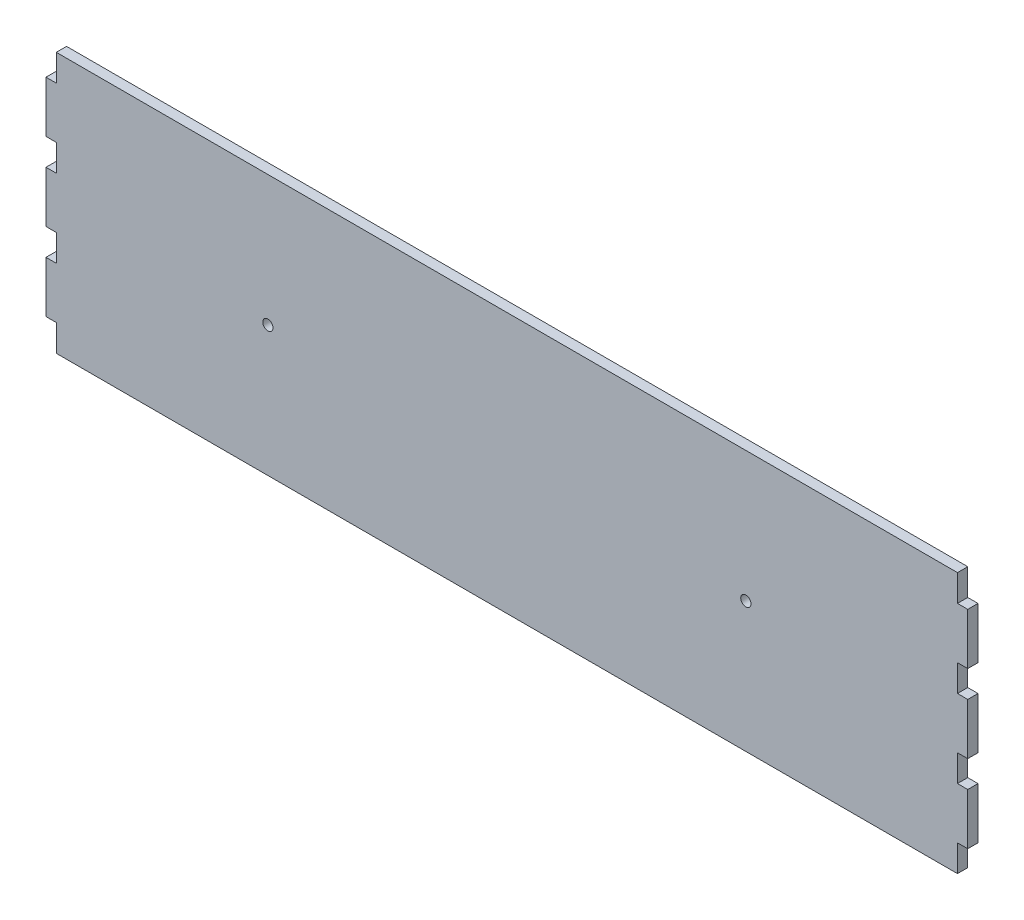
ISO-10303-21;
HEADER;
FILE_DESCRIPTION(('STEP AP214'),'2;1');
FILE_NAME('part.step','',(''),(''),'','','');
FILE_SCHEMA(('AUTOMOTIVE_DESIGN { 1 0 10303 214 1 1 1 1 }'));
ENDSEC;
DATA;
#1=APPLICATION_CONTEXT('core data for automotive mechanical design processes');
#2=APPLICATION_PROTOCOL_DEFINITION('international standard','automotive_design',2000,#1);
#3=PRODUCT_CONTEXT('',#1,'mechanical');
#4=PRODUCT('Part','Part','',(#3));
#5=PRODUCT_RELATED_PRODUCT_CATEGORY('part','',(#4));
#6=PRODUCT_DEFINITION_FORMATION('','',#4);
#7=PRODUCT_DEFINITION_CONTEXT('part definition',#1,'design');
#8=PRODUCT_DEFINITION('design','',#6,#7);
#9=PRODUCT_DEFINITION_SHAPE('','',#8);
#10=(LENGTH_UNIT() NAMED_UNIT(*) SI_UNIT(.MILLI.,.METRE.));
#11=(NAMED_UNIT(*) PLANE_ANGLE_UNIT() SI_UNIT($,.RADIAN.));
#12=(NAMED_UNIT(*) SI_UNIT($,.STERADIAN.) SOLID_ANGLE_UNIT());
#13=UNCERTAINTY_MEASURE_WITH_UNIT(LENGTH_MEASURE(1.E-05),#10,'distance_accuracy_value','');
#14=(GEOMETRIC_REPRESENTATION_CONTEXT(3) GLOBAL_UNCERTAINTY_ASSIGNED_CONTEXT((#13)) GLOBAL_UNIT_ASSIGNED_CONTEXT((#10,
#11,#12)) REPRESENTATION_CONTEXT('',''));
#15=CARTESIAN_POINT('',(0.,0.,0.));
#16=DIRECTION('',(0.,0.,1.));
#17=DIRECTION('',(1.,0.,0.));
#18=AXIS2_PLACEMENT_3D('',#15,#16,#17);
#19=CARTESIAN_POINT('',(134.7,38.1,3.));
#20=DIRECTION('',(-1.,0.,0.));
#21=DIRECTION('',(0.,0.,1.));
#22=AXIS2_PLACEMENT_3D('',#19,#20,#21);
#23=PLANE('',#22);
#24=DIRECTION('',(0.,0.,1.));
#25=VECTOR('',#24,1.);
#26=CARTESIAN_POINT('',(134.7,30.3,0.));
#27=LINE('',#26,#25);
#28=CARTESIAN_POINT('',(134.7,30.3,0.));
#29=VERTEX_POINT('',#28);
#30=CARTESIAN_POINT('',(134.7,30.3,3.));
#31=VERTEX_POINT('',#30);
#32=EDGE_CURVE('E314',#29,#31,#27,.T.);
#33=ORIENTED_EDGE('',*,*,#32,.T.);
#34=DIRECTION('',(0.,1.,0.));
#35=VECTOR('',#34,1.);
#36=CARTESIAN_POINT('',(134.7,38.1,3.));
#37=LINE('',#36,#35);
#38=CARTESIAN_POINT('',(134.7,15.3,3.));
#39=VERTEX_POINT('',#38);
#40=EDGE_CURVE('E260',#39,#31,#37,.T.);
#41=ORIENTED_EDGE('',*,*,#40,.F.);
#42=DIRECTION('',(0.,0.,1.));
#43=VECTOR('',#42,1.);
#44=CARTESIAN_POINT('',(134.7,15.3,0.));
#45=LINE('',#44,#43);
#46=CARTESIAN_POINT('',(134.7,15.3,0.));
#47=VERTEX_POINT('',#46);
#48=EDGE_CURVE('E496',#47,#39,#45,.T.);
#49=ORIENTED_EDGE('',*,*,#48,.F.);
#50=DIRECTION('',(0.,1.,0.));
#51=VECTOR('',#50,1.);
#52=CARTESIAN_POINT('',(134.7,38.1,0.));
#53=LINE('',#52,#51);
#54=EDGE_CURVE('E253',#47,#29,#53,.T.);
#55=ORIENTED_EDGE('',*,*,#54,.T.);
#56=EDGE_LOOP('',(#33,#41,#49,#55));
#57=FACE_BOUND('',#56,.T.);
#58=ADVANCED_FACE('F37',(#57),#23,.F.);
#59=DIRECTION('',(0.,0.,1.));
#60=VECTOR('',#59,1.);
#61=CARTESIAN_POINT('',(134.7,7.5,0.));
#62=LINE('',#61,#60);
#63=CARTESIAN_POINT('',(134.7,7.5,0.));
#64=VERTEX_POINT('',#63);
#65=CARTESIAN_POINT('',(134.7,7.5,3.));
#66=VERTEX_POINT('',#65);
#67=EDGE_CURVE('E484',#64,#66,#62,.T.);
#68=ORIENTED_EDGE('',*,*,#67,.T.);
#69=CARTESIAN_POINT('',(134.7,-7.5,3.));
#70=VERTEX_POINT('',#69);
#71=EDGE_CURVE('E339',#70,#66,#37,.T.);
#72=ORIENTED_EDGE('',*,*,#71,.F.);
#73=DIRECTION('',(0.,0.,1.));
#74=VECTOR('',#73,1.);
#75=CARTESIAN_POINT('',(134.7,-7.5,0.));
#76=LINE('',#75,#74);
#77=CARTESIAN_POINT('',(134.7,-7.5,0.));
#78=VERTEX_POINT('',#77);
#79=EDGE_CURVE('E482',#78,#70,#76,.T.);
#80=ORIENTED_EDGE('',*,*,#79,.F.);
#81=EDGE_CURVE('E251',#78,#64,#53,.T.);
#82=ORIENTED_EDGE('',*,*,#81,.T.);
#83=EDGE_LOOP('',(#68,#72,#80,#82));
#84=FACE_BOUND('',#83,.T.);
#85=ADVANCED_FACE('F447',(#84),#23,.F.);
#86=DIRECTION('',(0.,0.,1.));
#87=VECTOR('',#86,1.);
#88=CARTESIAN_POINT('',(134.7,-15.3,0.));
#89=LINE('',#88,#87);
#90=CARTESIAN_POINT('',(134.7,-15.3,0.));
#91=VERTEX_POINT('',#90);
#92=CARTESIAN_POINT('',(134.7,-15.3,3.));
#93=VERTEX_POINT('',#92);
#94=EDGE_CURVE('E461',#91,#93,#89,.T.);
#95=ORIENTED_EDGE('',*,*,#94,.T.);
#96=CARTESIAN_POINT('',(134.7,-30.3,3.));
#97=VERTEX_POINT('',#96);
#98=EDGE_CURVE('E340',#97,#93,#37,.T.);
#99=ORIENTED_EDGE('',*,*,#98,.F.);
#100=DIRECTION('',(0.,0.,1.));
#101=VECTOR('',#100,1.);
#102=CARTESIAN_POINT('',(134.7,-30.3,0.));
#103=LINE('',#102,#101);
#104=CARTESIAN_POINT('',(134.7,-30.3,0.));
#105=VERTEX_POINT('',#104);
#106=EDGE_CURVE('E393',#105,#97,#103,.T.);
#107=ORIENTED_EDGE('',*,*,#106,.F.);
#108=EDGE_CURVE('E245',#105,#91,#53,.T.);
#109=ORIENTED_EDGE('',*,*,#108,.T.);
#110=EDGE_LOOP('',(#95,#99,#107,#109));
#111=FACE_BOUND('',#110,.T.);
#112=ADVANCED_FACE('F449',(#111),#23,.F.);
#113=CARTESIAN_POINT('',(-134.7,38.1,3.));
#114=DIRECTION('',(0.,-1.,0.));
#115=DIRECTION('',(0.,0.,-1.));
#116=AXIS2_PLACEMENT_3D('',#113,#114,#115);
#117=PLANE('',#116);
#118=DIRECTION('',(0.,0.,1.));
#119=VECTOR('',#118,1.);
#120=CARTESIAN_POINT('',(131.7,38.1,0.));
#121=LINE('',#120,#119);
#122=CARTESIAN_POINT('',(131.7,38.1,0.));
#123=VERTEX_POINT('',#122);
#124=CARTESIAN_POINT('',(131.7,38.1,3.));
#125=VERTEX_POINT('',#124);
#126=EDGE_CURVE('E224',#123,#125,#121,.T.);
#127=ORIENTED_EDGE('',*,*,#126,.F.);
#128=DIRECTION('',(-1.,0.,0.));
#129=VECTOR('',#128,1.);
#130=CARTESIAN_POINT('',(-134.7,38.1,0.));
#131=LINE('',#130,#129);
#132=CARTESIAN_POINT('',(-131.7,38.1,0.));
#133=VERTEX_POINT('',#132);
#134=EDGE_CURVE('E236',#123,#133,#131,.T.);
#135=ORIENTED_EDGE('',*,*,#134,.T.);
#136=DIRECTION('',(0.,0.,1.));
#137=VECTOR('',#136,1.);
#138=CARTESIAN_POINT('',(-131.7,38.1,0.));
#139=LINE('',#138,#137);
#140=CARTESIAN_POINT('',(-131.7,38.1,3.));
#141=VERTEX_POINT('',#140);
#142=EDGE_CURVE('E332',#133,#141,#139,.T.);
#143=ORIENTED_EDGE('',*,*,#142,.T.);
#144=DIRECTION('',(-1.,0.,0.));
#145=VECTOR('',#144,1.);
#146=CARTESIAN_POINT('',(-134.7,38.1,3.));
#147=LINE('',#146,#145);
#148=EDGE_CURVE('E238',#125,#141,#147,.T.);
#149=ORIENTED_EDGE('',*,*,#148,.F.);
#150=EDGE_LOOP('',(#127,#135,#143,#149));
#151=FACE_BOUND('',#150,.T.);
#152=ADVANCED_FACE('F234',(#151),#117,.F.);
#153=CARTESIAN_POINT('',(-134.7,-38.1,3.));
#154=DIRECTION('',(0.,1.,0.));
#155=DIRECTION('',(0.,0.,1.));
#156=AXIS2_PLACEMENT_3D('',#153,#154,#155);
#157=PLANE('',#156);
#158=DIRECTION('',(0.,0.,1.));
#159=VECTOR('',#158,1.);
#160=CARTESIAN_POINT('',(131.7,-38.1,0.));
#161=LINE('',#160,#159);
#162=CARTESIAN_POINT('',(131.7,-38.1,0.));
#163=VERTEX_POINT('',#162);
#164=CARTESIAN_POINT('',(131.7,-38.1,3.));
#165=VERTEX_POINT('',#164);
#166=EDGE_CURVE('E372',#163,#165,#161,.T.);
#167=ORIENTED_EDGE('',*,*,#166,.T.);
#168=DIRECTION('',(1.,0.,0.));
#169=VECTOR('',#168,1.);
#170=CARTESIAN_POINT('',(-134.7,-38.1,3.));
#171=LINE('',#170,#169);
#172=CARTESIAN_POINT('',(-131.7,-38.1,3.));
#173=VERTEX_POINT('',#172);
#174=EDGE_CURVE('E11',#173,#165,#171,.T.);
#175=ORIENTED_EDGE('',*,*,#174,.F.);
#176=DIRECTION('',(0.,0.,1.));
#177=VECTOR('',#176,1.);
#178=CARTESIAN_POINT('',(-131.7,-38.1,0.));
#179=LINE('',#178,#177);
#180=CARTESIAN_POINT('',(-131.7,-38.1,0.));
#181=VERTEX_POINT('',#180);
#182=EDGE_CURVE('E310',#181,#173,#179,.T.);
#183=ORIENTED_EDGE('',*,*,#182,.F.);
#184=DIRECTION('',(1.,0.,0.));
#185=VECTOR('',#184,1.);
#186=CARTESIAN_POINT('',(-134.7,-38.1,0.));
#187=LINE('',#186,#185);
#188=EDGE_CURVE('E40',#181,#163,#187,.T.);
#189=ORIENTED_EDGE('',*,*,#188,.T.);
#190=EDGE_LOOP('',(#167,#175,#183,#189));
#191=FACE_BOUND('',#190,.T.);
#192=ADVANCED_FACE('F371',(#191),#157,.F.);
#193=CARTESIAN_POINT('',(0.,0.,3.));
#194=DIRECTION('',(0.,0.,1.));
#195=DIRECTION('',(1.,0.,0.));
#196=AXIS2_PLACEMENT_3D('',#193,#194,#195);
#197=PLANE('',#196);
#198=CARTESIAN_POINT('',(-69.8499999999999,0.,3.));
#199=DIRECTION('',(0.,0.,1.));
#200=DIRECTION('',(1.,0.,0.));
#201=AXIS2_PLACEMENT_3D('',#198,#199,#200);
#202=CIRCLE('',#201,1.49999999999999);
#203=CARTESIAN_POINT('',(-68.35,0.,3.));
#204=VERTEX_POINT('',#203);
#205=EDGE_CURVE('E705',#204,#204,#202,.T.);
#206=ORIENTED_EDGE('',*,*,#205,.F.);
#207=EDGE_LOOP('',(#206));
#208=FACE_BOUND('',#207,.T.);
#209=CARTESIAN_POINT('',(69.8499999999999,0.,3.));
#210=DIRECTION('',(0.,0.,1.));
#211=DIRECTION('',(1.,0.,0.));
#212=AXIS2_PLACEMENT_3D('',#209,#210,#211);
#213=CIRCLE('',#212,1.49999999999999);
#214=CARTESIAN_POINT('',(71.3499999999999,0.,3.));
#215=VERTEX_POINT('',#214);
#216=EDGE_CURVE('E707',#215,#215,#213,.T.);
#217=ORIENTED_EDGE('',*,*,#216,.F.);
#218=EDGE_LOOP('',(#217));
#219=FACE_BOUND('',#218,.T.);
#220=ORIENTED_EDGE('',*,*,#40,.T.);
#221=DIRECTION('',(-1.,0.,0.));
#222=VECTOR('',#221,1.);
#223=CARTESIAN_POINT('',(134.7,30.3,3.));
#224=LINE('',#223,#222);
#225=CARTESIAN_POINT('',(131.7,30.3,3.));
#226=VERTEX_POINT('',#225);
#227=EDGE_CURVE('E230',#31,#226,#224,.T.);
#228=ORIENTED_EDGE('',*,*,#227,.T.);
#229=DIRECTION('',(0.,1.,0.));
#230=VECTOR('',#229,1.);
#231=CARTESIAN_POINT('',(131.7,38.1,3.));
#232=LINE('',#231,#230);
#233=EDGE_CURVE('E487',#226,#125,#232,.T.);
#234=ORIENTED_EDGE('',*,*,#233,.T.);
#235=ORIENTED_EDGE('',*,*,#148,.T.);
#236=DIRECTION('',(0.,1.,0.));
#237=VECTOR('',#236,1.);
#238=CARTESIAN_POINT('',(-131.7,38.1,3.));
#239=LINE('',#238,#237);
#240=CARTESIAN_POINT('',(-131.7,30.3,3.));
#241=VERTEX_POINT('',#240);
#242=EDGE_CURVE('E323',#241,#141,#239,.T.);
#243=ORIENTED_EDGE('',*,*,#242,.F.);
#244=DIRECTION('',(1.,0.,0.));
#245=VECTOR('',#244,1.);
#246=CARTESIAN_POINT('',(-134.7,30.3,3.));
#247=LINE('',#246,#245);
#248=CARTESIAN_POINT('',(-134.7,30.3,3.));
#249=VERTEX_POINT('',#248);
#250=EDGE_CURVE('E326',#249,#241,#247,.T.);
#251=ORIENTED_EDGE('',*,*,#250,.F.);
#252=DIRECTION('',(0.,-1.,0.));
#253=VECTOR('',#252,1.);
#254=CARTESIAN_POINT('',(-134.7,38.1,3.));
#255=LINE('',#254,#253);
#256=CARTESIAN_POINT('',(-134.7,15.3,3.));
#257=VERTEX_POINT('',#256);
#258=EDGE_CURVE('E45',#249,#257,#255,.T.);
#259=ORIENTED_EDGE('',*,*,#258,.T.);
#260=DIRECTION('',(-1.,0.,0.));
#261=VECTOR('',#260,1.);
#262=CARTESIAN_POINT('',(-134.7,15.3,3.));
#263=LINE('',#262,#261);
#264=CARTESIAN_POINT('',(-131.7,15.3,3.));
#265=VERTEX_POINT('',#264);
#266=EDGE_CURVE('E397',#265,#257,#263,.T.);
#267=ORIENTED_EDGE('',*,*,#266,.F.);
#268=DIRECTION('',(0.,1.,0.));
#269=VECTOR('',#268,1.);
#270=CARTESIAN_POINT('',(-131.7,15.3,3.));
#271=LINE('',#270,#269);
#272=CARTESIAN_POINT('',(-131.7,7.5,3.));
#273=VERTEX_POINT('',#272);
#274=EDGE_CURVE('E404',#273,#265,#271,.T.);
#275=ORIENTED_EDGE('',*,*,#274,.F.);
#276=DIRECTION('',(1.,0.,0.));
#277=VECTOR('',#276,1.);
#278=CARTESIAN_POINT('',(-134.7,7.5,3.));
#279=LINE('',#278,#277);
#280=CARTESIAN_POINT('',(-134.7,7.5,3.));
#281=VERTEX_POINT('',#280);
#282=EDGE_CURVE('E299',#281,#273,#279,.T.);
#283=ORIENTED_EDGE('',*,*,#282,.F.);
#284=CARTESIAN_POINT('',(-134.7,-7.5,3.));
#285=VERTEX_POINT('',#284);
#286=EDGE_CURVE('E344',#281,#285,#255,.T.);
#287=ORIENTED_EDGE('',*,*,#286,.T.);
#288=DIRECTION('',(-1.,0.,0.));
#289=VECTOR('',#288,1.);
#290=CARTESIAN_POINT('',(-134.7,-7.5,3.));
#291=LINE('',#290,#289);
#292=CARTESIAN_POINT('',(-131.7,-7.5,3.));
#293=VERTEX_POINT('',#292);
#294=EDGE_CURVE('E296',#293,#285,#291,.T.);
#295=ORIENTED_EDGE('',*,*,#294,.F.);
#296=DIRECTION('',(0.,1.,0.));
#297=VECTOR('',#296,1.);
#298=CARTESIAN_POINT('',(-131.7,-7.5,3.));
#299=LINE('',#298,#297);
#300=CARTESIAN_POINT('',(-131.7,-15.3,3.));
#301=VERTEX_POINT('',#300);
#302=EDGE_CURVE('E292',#301,#293,#299,.T.);
#303=ORIENTED_EDGE('',*,*,#302,.F.);
#304=DIRECTION('',(1.,0.,0.));
#305=VECTOR('',#304,1.);
#306=CARTESIAN_POINT('',(-134.7,-15.3,3.));
#307=LINE('',#306,#305);
#308=CARTESIAN_POINT('',(-134.7,-15.3,3.));
#309=VERTEX_POINT('',#308);
#310=EDGE_CURVE('E289',#309,#301,#307,.T.);
#311=ORIENTED_EDGE('',*,*,#310,.F.);
#312=CARTESIAN_POINT('',(-134.7,-30.3,3.));
#313=VERTEX_POINT('',#312);
#314=EDGE_CURVE('E342',#309,#313,#255,.T.);
#315=ORIENTED_EDGE('',*,*,#314,.T.);
#316=DIRECTION('',(-1.,0.,0.));
#317=VECTOR('',#316,1.);
#318=CARTESIAN_POINT('',(-134.7,-30.3,3.));
#319=LINE('',#318,#317);
#320=CARTESIAN_POINT('',(-131.7,-30.3,3.));
#321=VERTEX_POINT('',#320);
#322=EDGE_CURVE('E307',#321,#313,#319,.T.);
#323=ORIENTED_EDGE('',*,*,#322,.F.);
#324=DIRECTION('',(0.,1.,0.));
#325=VECTOR('',#324,1.);
#326=CARTESIAN_POINT('',(-131.7,-30.3,3.));
#327=LINE('',#326,#325);
#328=EDGE_CURVE('E311',#173,#321,#327,.T.);
#329=ORIENTED_EDGE('',*,*,#328,.F.);
#330=ORIENTED_EDGE('',*,*,#174,.T.);
#331=DIRECTION('',(0.,1.,0.));
#332=VECTOR('',#331,1.);
#333=CARTESIAN_POINT('',(131.7,-30.3,3.));
#334=LINE('',#333,#332);
#335=CARTESIAN_POINT('',(131.7,-30.3,3.));
#336=VERTEX_POINT('',#335);
#337=EDGE_CURVE('E375',#165,#336,#334,.T.);
#338=ORIENTED_EDGE('',*,*,#337,.T.);
#339=DIRECTION('',(1.,0.,0.));
#340=VECTOR('',#339,1.);
#341=CARTESIAN_POINT('',(134.7,-30.3,3.));
#342=LINE('',#341,#340);
#343=EDGE_CURVE('E378',#336,#97,#342,.T.);
#344=ORIENTED_EDGE('',*,*,#343,.T.);
#345=ORIENTED_EDGE('',*,*,#98,.T.);
#346=DIRECTION('',(-1.,0.,0.));
#347=VECTOR('',#346,1.);
#348=CARTESIAN_POINT('',(134.7,-15.3,3.));
#349=LINE('',#348,#347);
#350=CARTESIAN_POINT('',(131.7,-15.3,3.));
#351=VERTEX_POINT('',#350);
#352=EDGE_CURVE('E471',#93,#351,#349,.T.);
#353=ORIENTED_EDGE('',*,*,#352,.T.);
#354=DIRECTION('',(0.,1.,0.));
#355=VECTOR('',#354,1.);
#356=CARTESIAN_POINT('',(131.7,-7.5,3.));
#357=LINE('',#356,#355);
#358=CARTESIAN_POINT('',(131.7,-7.5,3.));
#359=VERTEX_POINT('',#358);
#360=EDGE_CURVE('E507',#351,#359,#357,.T.);
#361=ORIENTED_EDGE('',*,*,#360,.T.);
#362=DIRECTION('',(1.,0.,0.));
#363=VECTOR('',#362,1.);
#364=CARTESIAN_POINT('',(134.7,-7.5,3.));
#365=LINE('',#364,#363);
#366=EDGE_CURVE('E390',#359,#70,#365,.T.);
#367=ORIENTED_EDGE('',*,*,#366,.T.);
#368=ORIENTED_EDGE('',*,*,#71,.T.);
#369=DIRECTION('',(-1.,0.,0.));
#370=VECTOR('',#369,1.);
#371=CARTESIAN_POINT('',(134.7,7.5,3.));
#372=LINE('',#371,#370);
#373=CARTESIAN_POINT('',(131.7,7.5,3.));
#374=VERTEX_POINT('',#373);
#375=EDGE_CURVE('E477',#66,#374,#372,.T.);
#376=ORIENTED_EDGE('',*,*,#375,.T.);
#377=DIRECTION('',(0.,1.,0.));
#378=VECTOR('',#377,1.);
#379=CARTESIAN_POINT('',(131.7,15.3,3.));
#380=LINE('',#379,#378);
#381=CARTESIAN_POINT('',(131.7,15.3,3.));
#382=VERTEX_POINT('',#381);
#383=EDGE_CURVE('E725',#374,#382,#380,.T.);
#384=ORIENTED_EDGE('',*,*,#383,.T.);
#385=DIRECTION('',(1.,0.,0.));
#386=VECTOR('',#385,1.);
#387=CARTESIAN_POINT('',(134.7,15.3,3.));
#388=LINE('',#387,#386);
#389=EDGE_CURVE('E466',#382,#39,#388,.T.);
#390=ORIENTED_EDGE('',*,*,#389,.T.);
#391=EDGE_LOOP('',(#220,#228,#234,#235,#243,#251,#259,#267,#275,#283,#287,#295,#303,#311,#315,
#323,#329,#330,#338,#344,#345,#353,#361,#367,#368,#376,#384,#390));
#392=FACE_BOUND('',#391,.T.);
#393=ADVANCED_FACE('F353',(#208,#219,#392),#197,.T.);
#394=CARTESIAN_POINT('',(0.,0.,0.));
#395=DIRECTION('',(0.,0.,1.));
#396=DIRECTION('',(1.,0.,0.));
#397=AXIS2_PLACEMENT_3D('',#394,#395,#396);
#398=PLANE('',#397);
#399=CARTESIAN_POINT('',(-69.8499999999999,0.,0.));
#400=DIRECTION('',(0.,0.,1.));
#401=DIRECTION('',(1.,0.,0.));
#402=AXIS2_PLACEMENT_3D('',#399,#400,#401);
#403=CIRCLE('',#402,1.5);
#404=CARTESIAN_POINT('',(-68.3499999999999,0.,0.));
#405=VERTEX_POINT('',#404);
#406=EDGE_CURVE('E702',#405,#405,#403,.T.);
#407=ORIENTED_EDGE('',*,*,#406,.T.);
#408=EDGE_LOOP('',(#407));
#409=FACE_BOUND('',#408,.T.);
#410=CARTESIAN_POINT('',(69.8499999999999,0.,0.));
#411=DIRECTION('',(0.,0.,1.));
#412=DIRECTION('',(1.,0.,0.));
#413=AXIS2_PLACEMENT_3D('',#410,#411,#412);
#414=CIRCLE('',#413,1.5);
#415=CARTESIAN_POINT('',(71.3499999999999,0.,0.));
#416=VERTEX_POINT('',#415);
#417=EDGE_CURVE('E385',#416,#416,#414,.T.);
#418=ORIENTED_EDGE('',*,*,#417,.T.);
#419=EDGE_LOOP('',(#418));
#420=FACE_BOUND('',#419,.T.);
#421=DIRECTION('',(-1.,0.,0.));
#422=VECTOR('',#421,1.);
#423=CARTESIAN_POINT('',(134.7,30.3,0.));
#424=LINE('',#423,#422);
#425=CARTESIAN_POINT('',(131.7,30.3,0.));
#426=VERTEX_POINT('',#425);
#427=EDGE_CURVE('E229',#29,#426,#424,.T.);
#428=ORIENTED_EDGE('',*,*,#427,.F.);
#429=ORIENTED_EDGE('',*,*,#54,.F.);
#430=DIRECTION('',(1.,0.,0.));
#431=VECTOR('',#430,1.);
#432=CARTESIAN_POINT('',(134.7,15.3,0.));
#433=LINE('',#432,#431);
#434=CARTESIAN_POINT('',(131.7,15.3,0.));
#435=VERTEX_POINT('',#434);
#436=EDGE_CURVE('E719',#435,#47,#433,.T.);
#437=ORIENTED_EDGE('',*,*,#436,.F.);
#438=DIRECTION('',(0.,1.,0.));
#439=VECTOR('',#438,1.);
#440=CARTESIAN_POINT('',(131.7,15.3,0.));
#441=LINE('',#440,#439);
#442=CARTESIAN_POINT('',(131.7,7.5,0.));
#443=VERTEX_POINT('',#442);
#444=EDGE_CURVE('E721',#443,#435,#441,.T.);
#445=ORIENTED_EDGE('',*,*,#444,.F.);
#446=DIRECTION('',(-1.,0.,0.));
#447=VECTOR('',#446,1.);
#448=CARTESIAN_POINT('',(134.7,7.5,0.));
#449=LINE('',#448,#447);
#450=EDGE_CURVE('E498',#64,#443,#449,.T.);
#451=ORIENTED_EDGE('',*,*,#450,.F.);
#452=ORIENTED_EDGE('',*,*,#81,.F.);
#453=DIRECTION('',(1.,0.,0.));
#454=VECTOR('',#453,1.);
#455=CARTESIAN_POINT('',(134.7,-7.5,0.));
#456=LINE('',#455,#454);
#457=CARTESIAN_POINT('',(131.7,-7.5,0.));
#458=VERTEX_POINT('',#457);
#459=EDGE_CURVE('E499',#458,#78,#456,.T.);
#460=ORIENTED_EDGE('',*,*,#459,.F.);
#461=DIRECTION('',(0.,1.,0.));
#462=VECTOR('',#461,1.);
#463=CARTESIAN_POINT('',(131.7,-7.5,0.));
#464=LINE('',#463,#462);
#465=CARTESIAN_POINT('',(131.7,-15.3,0.));
#466=VERTEX_POINT('',#465);
#467=EDGE_CURVE('E501',#466,#458,#464,.T.);
#468=ORIENTED_EDGE('',*,*,#467,.F.);
#469=DIRECTION('',(-1.,0.,0.));
#470=VECTOR('',#469,1.);
#471=CARTESIAN_POINT('',(134.7,-15.3,0.));
#472=LINE('',#471,#470);
#473=EDGE_CURVE('E504',#91,#466,#472,.T.);
#474=ORIENTED_EDGE('',*,*,#473,.F.);
#475=ORIENTED_EDGE('',*,*,#108,.F.);
#476=DIRECTION('',(1.,0.,0.));
#477=VECTOR('',#476,1.);
#478=CARTESIAN_POINT('',(134.7,-30.3,0.));
#479=LINE('',#478,#477);
#480=CARTESIAN_POINT('',(131.7,-30.3,0.));
#481=VERTEX_POINT('',#480);
#482=EDGE_CURVE('E381',#481,#105,#479,.T.);
#483=ORIENTED_EDGE('',*,*,#482,.F.);
#484=DIRECTION('',(0.,1.,0.));
#485=VECTOR('',#484,1.);
#486=CARTESIAN_POINT('',(131.7,-30.3,0.));
#487=LINE('',#486,#485);
#488=EDGE_CURVE('E383',#163,#481,#487,.T.);
#489=ORIENTED_EDGE('',*,*,#488,.F.);
#490=ORIENTED_EDGE('',*,*,#188,.F.);
#491=DIRECTION('',(0.,1.,0.));
#492=VECTOR('',#491,1.);
#493=CARTESIAN_POINT('',(-131.7,-30.3,0.));
#494=LINE('',#493,#492);
#495=CARTESIAN_POINT('',(-131.7,-30.3,0.));
#496=VERTEX_POINT('',#495);
#497=EDGE_CURVE('E303',#181,#496,#494,.T.);
#498=ORIENTED_EDGE('',*,*,#497,.T.);
#499=DIRECTION('',(-1.,0.,0.));
#500=VECTOR('',#499,1.);
#501=CARTESIAN_POINT('',(-134.7,-30.3,0.));
#502=LINE('',#501,#500);
#503=CARTESIAN_POINT('',(-134.7,-30.3,0.));
#504=VERTEX_POINT('',#503);
#505=EDGE_CURVE('E306',#496,#504,#502,.T.);
#506=ORIENTED_EDGE('',*,*,#505,.T.);
#507=DIRECTION('',(0.,-1.,0.));
#508=VECTOR('',#507,1.);
#509=CARTESIAN_POINT('',(-134.7,38.1,0.));
#510=LINE('',#509,#508);
#511=CARTESIAN_POINT('',(-134.7,-15.3,0.));
#512=VERTEX_POINT('',#511);
#513=EDGE_CURVE('E244',#512,#504,#510,.T.);
#514=ORIENTED_EDGE('',*,*,#513,.F.);
#515=DIRECTION('',(1.,0.,0.));
#516=VECTOR('',#515,1.);
#517=CARTESIAN_POINT('',(-134.7,-15.3,0.));
#518=LINE('',#517,#516);
#519=CARTESIAN_POINT('',(-131.7,-15.3,0.));
#520=VERTEX_POINT('',#519);
#521=EDGE_CURVE('E285',#512,#520,#518,.T.);
#522=ORIENTED_EDGE('',*,*,#521,.T.);
#523=DIRECTION('',(0.,1.,0.));
#524=VECTOR('',#523,1.);
#525=CARTESIAN_POINT('',(-131.7,-7.5,0.));
#526=LINE('',#525,#524);
#527=CARTESIAN_POINT('',(-131.7,-7.5,0.));
#528=VERTEX_POINT('',#527);
#529=EDGE_CURVE('E279',#520,#528,#526,.T.);
#530=ORIENTED_EDGE('',*,*,#529,.T.);
#531=DIRECTION('',(-1.,0.,0.));
#532=VECTOR('',#531,1.);
#533=CARTESIAN_POINT('',(-134.7,-7.5,0.));
#534=LINE('',#533,#532);
#535=CARTESIAN_POINT('',(-134.7,-7.5,0.));
#536=VERTEX_POINT('',#535);
#537=EDGE_CURVE('E277',#528,#536,#534,.T.);
#538=ORIENTED_EDGE('',*,*,#537,.T.);
#539=CARTESIAN_POINT('',(-134.7,7.5,0.));
#540=VERTEX_POINT('',#539);
#541=EDGE_CURVE('E248',#540,#536,#510,.T.);
#542=ORIENTED_EDGE('',*,*,#541,.F.);
#543=DIRECTION('',(1.,0.,0.));
#544=VECTOR('',#543,1.);
#545=CARTESIAN_POINT('',(-134.7,7.5,0.));
#546=LINE('',#545,#544);
#547=CARTESIAN_POINT('',(-131.7,7.5,0.));
#548=VERTEX_POINT('',#547);
#549=EDGE_CURVE('E274',#540,#548,#546,.T.);
#550=ORIENTED_EDGE('',*,*,#549,.T.);
#551=DIRECTION('',(0.,1.,0.));
#552=VECTOR('',#551,1.);
#553=CARTESIAN_POINT('',(-131.7,15.3,0.));
#554=LINE('',#553,#552);
#555=CARTESIAN_POINT('',(-131.7,15.3,0.));
#556=VERTEX_POINT('',#555);
#557=EDGE_CURVE('E396',#548,#556,#554,.T.);
#558=ORIENTED_EDGE('',*,*,#557,.T.);
#559=DIRECTION('',(-1.,0.,0.));
#560=VECTOR('',#559,1.);
#561=CARTESIAN_POINT('',(-134.7,15.3,0.));
#562=LINE('',#561,#560);
#563=CARTESIAN_POINT('',(-134.7,15.3,0.));
#564=VERTEX_POINT('',#563);
#565=EDGE_CURVE('E399',#556,#564,#562,.T.);
#566=ORIENTED_EDGE('',*,*,#565,.T.);
#567=CARTESIAN_POINT('',(-134.7,30.3,0.));
#568=VERTEX_POINT('',#567);
#569=EDGE_CURVE('E249',#568,#564,#510,.T.);
#570=ORIENTED_EDGE('',*,*,#569,.F.);
#571=DIRECTION('',(1.,0.,0.));
#572=VECTOR('',#571,1.);
#573=CARTESIAN_POINT('',(-134.7,30.3,0.));
#574=LINE('',#573,#572);
#575=CARTESIAN_POINT('',(-131.7,30.3,0.));
#576=VERTEX_POINT('',#575);
#577=EDGE_CURVE('E321',#568,#576,#574,.T.);
#578=ORIENTED_EDGE('',*,*,#577,.T.);
#579=DIRECTION('',(0.,1.,0.));
#580=VECTOR('',#579,1.);
#581=CARTESIAN_POINT('',(-131.7,38.1,0.));
#582=LINE('',#581,#580);
#583=EDGE_CURVE('E243',#576,#133,#582,.T.);
#584=ORIENTED_EDGE('',*,*,#583,.T.);
#585=ORIENTED_EDGE('',*,*,#134,.F.);
#586=DIRECTION('',(0.,1.,0.));
#587=VECTOR('',#586,1.);
#588=CARTESIAN_POINT('',(131.7,38.1,0.));
#589=LINE('',#588,#587);
#590=EDGE_CURVE('E221',#426,#123,#589,.T.);
#591=ORIENTED_EDGE('',*,*,#590,.F.);
#592=EDGE_LOOP('',(#428,#429,#437,#445,#451,#452,#460,#468,#474,#475,#483,#489,#490,#498,#506,
#514,#522,#530,#538,#542,#550,#558,#566,#570,#578,#584,#585,#591));
#593=FACE_BOUND('',#592,.T.);
#594=ADVANCED_FACE('F241',(#409,#420,#593),#398,.F.);
#595=CARTESIAN_POINT('',(-134.7,38.1,3.));
#596=DIRECTION('',(1.,0.,0.));
#597=DIRECTION('',(0.,0.,-1.));
#598=AXIS2_PLACEMENT_3D('',#595,#596,#597);
#599=PLANE('',#598);
#600=ORIENTED_EDGE('',*,*,#569,.T.);
#601=DIRECTION('',(0.,0.,1.));
#602=VECTOR('',#601,1.);
#603=CARTESIAN_POINT('',(-134.7,15.3,0.));
#604=LINE('',#603,#602);
#605=EDGE_CURVE('E329',#564,#257,#604,.T.);
#606=ORIENTED_EDGE('',*,*,#605,.T.);
#607=ORIENTED_EDGE('',*,*,#258,.F.);
#608=DIRECTION('',(0.,0.,1.));
#609=VECTOR('',#608,1.);
#610=CARTESIAN_POINT('',(-134.7,30.3,0.));
#611=LINE('',#610,#609);
#612=EDGE_CURVE('E325',#568,#249,#611,.T.);
#613=ORIENTED_EDGE('',*,*,#612,.F.);
#614=EDGE_LOOP('',(#600,#606,#607,#613));
#615=FACE_BOUND('',#614,.T.);
#616=ADVANCED_FACE('F430',(#615),#599,.F.);
#617=ORIENTED_EDGE('',*,*,#286,.F.);
#618=DIRECTION('',(0.,0.,1.));
#619=VECTOR('',#618,1.);
#620=CARTESIAN_POINT('',(-134.7,7.5,0.));
#621=LINE('',#620,#619);
#622=EDGE_CURVE('E270',#540,#281,#621,.T.);
#623=ORIENTED_EDGE('',*,*,#622,.F.);
#624=ORIENTED_EDGE('',*,*,#541,.T.);
#625=DIRECTION('',(0.,0.,1.));
#626=VECTOR('',#625,1.);
#627=CARTESIAN_POINT('',(-134.7,-7.5,0.));
#628=LINE('',#627,#626);
#629=EDGE_CURVE('E268',#536,#285,#628,.T.);
#630=ORIENTED_EDGE('',*,*,#629,.T.);
#631=EDGE_LOOP('',(#617,#623,#624,#630));
#632=FACE_BOUND('',#631,.T.);
#633=ADVANCED_FACE('F267',(#632),#599,.F.);
#634=ORIENTED_EDGE('',*,*,#314,.F.);
#635=DIRECTION('',(0.,0.,1.));
#636=VECTOR('',#635,1.);
#637=CARTESIAN_POINT('',(-134.7,-15.3,0.));
#638=LINE('',#637,#636);
#639=EDGE_CURVE('E281',#512,#309,#638,.T.);
#640=ORIENTED_EDGE('',*,*,#639,.F.);
#641=ORIENTED_EDGE('',*,*,#513,.T.);
#642=DIRECTION('',(0.,0.,1.));
#643=VECTOR('',#642,1.);
#644=CARTESIAN_POINT('',(-134.7,-30.3,0.));
#645=LINE('',#644,#643);
#646=EDGE_CURVE('E293',#504,#313,#645,.T.);
#647=ORIENTED_EDGE('',*,*,#646,.T.);
#648=EDGE_LOOP('',(#634,#640,#641,#647));
#649=FACE_BOUND('',#648,.T.);
#650=ADVANCED_FACE('F358',(#649),#599,.F.);
#651=CARTESIAN_POINT('',(-131.7,38.1,0.));
#652=DIRECTION('',(1.,0.,0.));
#653=DIRECTION('',(0.,0.,-1.));
#654=AXIS2_PLACEMENT_3D('',#651,#652,#653);
#655=PLANE('',#654);
#656=ORIENTED_EDGE('',*,*,#242,.T.);
#657=ORIENTED_EDGE('',*,*,#142,.F.);
#658=ORIENTED_EDGE('',*,*,#583,.F.);
#659=DIRECTION('',(0.,0.,1.));
#660=VECTOR('',#659,1.);
#661=CARTESIAN_POINT('',(-131.7,30.3,0.));
#662=LINE('',#661,#660);
#663=EDGE_CURVE('E334',#576,#241,#662,.T.);
#664=ORIENTED_EDGE('',*,*,#663,.T.);
#665=EDGE_LOOP('',(#656,#657,#658,#664));
#666=FACE_BOUND('',#665,.T.);
#667=ADVANCED_FACE('F436',(#666),#655,.F.);
#668=CARTESIAN_POINT('',(-134.7,30.3,0.));
#669=DIRECTION('',(0.,-1.,0.));
#670=DIRECTION('',(0.,0.,-1.));
#671=AXIS2_PLACEMENT_3D('',#668,#669,#670);
#672=PLANE('',#671);
#673=ORIENTED_EDGE('',*,*,#250,.T.);
#674=ORIENTED_EDGE('',*,*,#663,.F.);
#675=ORIENTED_EDGE('',*,*,#577,.F.);
#676=ORIENTED_EDGE('',*,*,#612,.T.);
#677=EDGE_LOOP('',(#673,#674,#675,#676));
#678=FACE_BOUND('',#677,.T.);
#679=ADVANCED_FACE('F432',(#678),#672,.F.);
#680=CARTESIAN_POINT('',(-134.7,-30.3,0.));
#681=DIRECTION('',(0.,1.,0.));
#682=DIRECTION('',(0.,0.,1.));
#683=AXIS2_PLACEMENT_3D('',#680,#681,#682);
#684=PLANE('',#683);
#685=ORIENTED_EDGE('',*,*,#322,.T.);
#686=ORIENTED_EDGE('',*,*,#646,.F.);
#687=ORIENTED_EDGE('',*,*,#505,.F.);
#688=DIRECTION('',(0.,0.,1.));
#689=VECTOR('',#688,1.);
#690=CARTESIAN_POINT('',(-131.7,-30.3,0.));
#691=LINE('',#690,#689);
#692=EDGE_CURVE('E318',#496,#321,#691,.T.);
#693=ORIENTED_EDGE('',*,*,#692,.T.);
#694=EDGE_LOOP('',(#685,#686,#687,#693));
#695=FACE_BOUND('',#694,.T.);
#696=ADVANCED_FACE('F361',(#695),#684,.F.);
#697=CARTESIAN_POINT('',(-131.7,-30.3,0.));
#698=DIRECTION('',(1.,0.,0.));
#699=DIRECTION('',(0.,0.,-1.));
#700=AXIS2_PLACEMENT_3D('',#697,#698,#699);
#701=PLANE('',#700);
#702=ORIENTED_EDGE('',*,*,#328,.T.);
#703=ORIENTED_EDGE('',*,*,#692,.F.);
#704=ORIENTED_EDGE('',*,*,#497,.F.);
#705=ORIENTED_EDGE('',*,*,#182,.T.);
#706=EDGE_LOOP('',(#702,#703,#704,#705));
#707=FACE_BOUND('',#706,.T.);
#708=ADVANCED_FACE('F367',(#707),#701,.F.);
#709=CARTESIAN_POINT('',(-134.7,-7.5,0.));
#710=DIRECTION('',(0.,1.,0.));
#711=DIRECTION('',(0.,0.,1.));
#712=AXIS2_PLACEMENT_3D('',#709,#710,#711);
#713=PLANE('',#712);
#714=ORIENTED_EDGE('',*,*,#294,.T.);
#715=ORIENTED_EDGE('',*,*,#629,.F.);
#716=ORIENTED_EDGE('',*,*,#537,.F.);
#717=DIRECTION('',(0.,0.,1.));
#718=VECTOR('',#717,1.);
#719=CARTESIAN_POINT('',(-131.7,-7.5,0.));
#720=LINE('',#719,#718);
#721=EDGE_CURVE('E300',#528,#293,#720,.T.);
#722=ORIENTED_EDGE('',*,*,#721,.T.);
#723=EDGE_LOOP('',(#714,#715,#716,#722));
#724=FACE_BOUND('',#723,.T.);
#725=ADVANCED_FACE('F419',(#724),#713,.F.);
#726=CARTESIAN_POINT('',(-131.7,-7.5,0.));
#727=DIRECTION('',(1.,0.,0.));
#728=DIRECTION('',(0.,0.,-1.));
#729=AXIS2_PLACEMENT_3D('',#726,#727,#728);
#730=PLANE('',#729);
#731=ORIENTED_EDGE('',*,*,#302,.T.);
#732=ORIENTED_EDGE('',*,*,#721,.F.);
#733=ORIENTED_EDGE('',*,*,#529,.F.);
#734=DIRECTION('',(0.,0.,1.));
#735=VECTOR('',#734,1.);
#736=CARTESIAN_POINT('',(-131.7,-15.3,0.));
#737=LINE('',#736,#735);
#738=EDGE_CURVE('E283',#520,#301,#737,.T.);
#739=ORIENTED_EDGE('',*,*,#738,.T.);
#740=EDGE_LOOP('',(#731,#732,#733,#739));
#741=FACE_BOUND('',#740,.T.);
#742=ADVANCED_FACE('F417',(#741),#730,.F.);
#743=CARTESIAN_POINT('',(-134.7,-15.3,0.));
#744=DIRECTION('',(0.,-1.,0.));
#745=DIRECTION('',(0.,0.,-1.));
#746=AXIS2_PLACEMENT_3D('',#743,#744,#745);
#747=PLANE('',#746);
#748=ORIENTED_EDGE('',*,*,#310,.T.);
#749=ORIENTED_EDGE('',*,*,#738,.F.);
#750=ORIENTED_EDGE('',*,*,#521,.F.);
#751=ORIENTED_EDGE('',*,*,#639,.T.);
#752=EDGE_LOOP('',(#748,#749,#750,#751));
#753=FACE_BOUND('',#752,.T.);
#754=ADVANCED_FACE('F415',(#753),#747,.F.);
#755=CARTESIAN_POINT('',(-134.7,15.3,0.));
#756=DIRECTION('',(0.,1.,0.));
#757=DIRECTION('',(0.,0.,1.));
#758=AXIS2_PLACEMENT_3D('',#755,#756,#757);
#759=PLANE('',#758);
#760=ORIENTED_EDGE('',*,*,#266,.T.);
#761=ORIENTED_EDGE('',*,*,#605,.F.);
#762=ORIENTED_EDGE('',*,*,#565,.F.);
#763=DIRECTION('',(0.,0.,1.));
#764=VECTOR('',#763,1.);
#765=CARTESIAN_POINT('',(-131.7,15.3,0.));
#766=LINE('',#765,#764);
#767=EDGE_CURVE('E409',#556,#265,#766,.T.);
#768=ORIENTED_EDGE('',*,*,#767,.T.);
#769=EDGE_LOOP('',(#760,#761,#762,#768));
#770=FACE_BOUND('',#769,.T.);
#771=ADVANCED_FACE('F429',(#770),#759,.F.);
#772=CARTESIAN_POINT('',(-131.7,15.3,0.));
#773=DIRECTION('',(1.,0.,0.));
#774=DIRECTION('',(0.,0.,-1.));
#775=AXIS2_PLACEMENT_3D('',#772,#773,#774);
#776=PLANE('',#775);
#777=ORIENTED_EDGE('',*,*,#274,.T.);
#778=ORIENTED_EDGE('',*,*,#767,.F.);
#779=ORIENTED_EDGE('',*,*,#557,.F.);
#780=DIRECTION('',(0.,0.,1.));
#781=VECTOR('',#780,1.);
#782=CARTESIAN_POINT('',(-131.7,7.5,0.));
#783=LINE('',#782,#781);
#784=EDGE_CURVE('E411',#548,#273,#783,.T.);
#785=ORIENTED_EDGE('',*,*,#784,.T.);
#786=EDGE_LOOP('',(#777,#778,#779,#785));
#787=FACE_BOUND('',#786,.T.);
#788=ADVANCED_FACE('F426',(#787),#776,.F.);
#789=CARTESIAN_POINT('',(-134.7,7.5,0.));
#790=DIRECTION('',(0.,-1.,0.));
#791=DIRECTION('',(0.,0.,-1.));
#792=AXIS2_PLACEMENT_3D('',#789,#790,#791);
#793=PLANE('',#792);
#794=ORIENTED_EDGE('',*,*,#282,.T.);
#795=ORIENTED_EDGE('',*,*,#784,.F.);
#796=ORIENTED_EDGE('',*,*,#549,.F.);
#797=ORIENTED_EDGE('',*,*,#622,.T.);
#798=EDGE_LOOP('',(#794,#795,#796,#797));
#799=FACE_BOUND('',#798,.T.);
#800=ADVANCED_FACE('F424',(#799),#793,.F.);
#801=CARTESIAN_POINT('',(131.7,-30.3,0.));
#802=DIRECTION('',(1.,0.,0.));
#803=DIRECTION('',(0.,0.,-1.));
#804=AXIS2_PLACEMENT_3D('',#801,#802,#803);
#805=PLANE('',#804);
#806=ORIENTED_EDGE('',*,*,#337,.F.);
#807=ORIENTED_EDGE('',*,*,#166,.F.);
#808=ORIENTED_EDGE('',*,*,#488,.T.);
#809=DIRECTION('',(0.,0.,1.));
#810=VECTOR('',#809,1.);
#811=CARTESIAN_POINT('',(131.7,-30.3,0.));
#812=LINE('',#811,#810);
#813=EDGE_CURVE('E391',#481,#336,#812,.T.);
#814=ORIENTED_EDGE('',*,*,#813,.T.);
#815=EDGE_LOOP('',(#806,#807,#808,#814));
#816=FACE_BOUND('',#815,.T.);
#817=ADVANCED_FACE('F515',(#816),#805,.T.);
#818=CARTESIAN_POINT('',(134.7,-30.3,0.));
#819=DIRECTION('',(0.,-1.,0.));
#820=DIRECTION('',(0.,0.,-1.));
#821=AXIS2_PLACEMENT_3D('',#818,#819,#820);
#822=PLANE('',#821);
#823=ORIENTED_EDGE('',*,*,#343,.F.);
#824=ORIENTED_EDGE('',*,*,#813,.F.);
#825=ORIENTED_EDGE('',*,*,#482,.T.);
#826=ORIENTED_EDGE('',*,*,#106,.T.);
#827=EDGE_LOOP('',(#823,#824,#825,#826));
#828=FACE_BOUND('',#827,.T.);
#829=ADVANCED_FACE('F517',(#828),#822,.T.);
#830=CARTESIAN_POINT('',(134.7,-15.3,0.));
#831=DIRECTION('',(0.,1.,0.));
#832=DIRECTION('',(0.,0.,1.));
#833=AXIS2_PLACEMENT_3D('',#830,#831,#832);
#834=PLANE('',#833);
#835=ORIENTED_EDGE('',*,*,#352,.F.);
#836=ORIENTED_EDGE('',*,*,#94,.F.);
#837=ORIENTED_EDGE('',*,*,#473,.T.);
#838=DIRECTION('',(0.,0.,1.));
#839=VECTOR('',#838,1.);
#840=CARTESIAN_POINT('',(131.7,-15.3,0.));
#841=LINE('',#840,#839);
#842=EDGE_CURVE('E467',#466,#351,#841,.T.);
#843=ORIENTED_EDGE('',*,*,#842,.T.);
#844=EDGE_LOOP('',(#835,#836,#837,#843));
#845=FACE_BOUND('',#844,.T.);
#846=ADVANCED_FACE('F519',(#845),#834,.T.);
#847=CARTESIAN_POINT('',(131.7,-7.5,0.));
#848=DIRECTION('',(1.,0.,0.));
#849=DIRECTION('',(0.,0.,-1.));
#850=AXIS2_PLACEMENT_3D('',#847,#848,#849);
#851=PLANE('',#850);
#852=ORIENTED_EDGE('',*,*,#360,.F.);
#853=ORIENTED_EDGE('',*,*,#842,.F.);
#854=ORIENTED_EDGE('',*,*,#467,.T.);
#855=DIRECTION('',(0.,0.,1.));
#856=VECTOR('',#855,1.);
#857=CARTESIAN_POINT('',(131.7,-7.5,0.));
#858=LINE('',#857,#856);
#859=EDGE_CURVE('E511',#458,#359,#858,.T.);
#860=ORIENTED_EDGE('',*,*,#859,.T.);
#861=EDGE_LOOP('',(#852,#853,#854,#860));
#862=FACE_BOUND('',#861,.T.);
#863=ADVANCED_FACE('F525',(#862),#851,.T.);
#864=CARTESIAN_POINT('',(134.7,-7.5,0.));
#865=DIRECTION('',(0.,-1.,0.));
#866=DIRECTION('',(0.,0.,-1.));
#867=AXIS2_PLACEMENT_3D('',#864,#865,#866);
#868=PLANE('',#867);
#869=ORIENTED_EDGE('',*,*,#366,.F.);
#870=ORIENTED_EDGE('',*,*,#859,.F.);
#871=ORIENTED_EDGE('',*,*,#459,.T.);
#872=ORIENTED_EDGE('',*,*,#79,.T.);
#873=EDGE_LOOP('',(#869,#870,#871,#872));
#874=FACE_BOUND('',#873,.T.);
#875=ADVANCED_FACE('F601',(#874),#868,.T.);
#876=CARTESIAN_POINT('',(134.7,7.5,0.));
#877=DIRECTION('',(0.,1.,0.));
#878=DIRECTION('',(0.,0.,1.));
#879=AXIS2_PLACEMENT_3D('',#876,#877,#878);
#880=PLANE('',#879);
#881=ORIENTED_EDGE('',*,*,#375,.F.);
#882=ORIENTED_EDGE('',*,*,#67,.F.);
#883=ORIENTED_EDGE('',*,*,#450,.T.);
#884=DIRECTION('',(0.,0.,1.));
#885=VECTOR('',#884,1.);
#886=CARTESIAN_POINT('',(131.7,7.5,0.));
#887=LINE('',#886,#885);
#888=EDGE_CURVE('E488',#443,#374,#887,.T.);
#889=ORIENTED_EDGE('',*,*,#888,.T.);
#890=EDGE_LOOP('',(#881,#882,#883,#889));
#891=FACE_BOUND('',#890,.T.);
#892=ADVANCED_FACE('F611',(#891),#880,.T.);
#893=CARTESIAN_POINT('',(131.7,15.3,0.));
#894=DIRECTION('',(1.,0.,0.));
#895=DIRECTION('',(0.,0.,-1.));
#896=AXIS2_PLACEMENT_3D('',#893,#894,#895);
#897=PLANE('',#896);
#898=ORIENTED_EDGE('',*,*,#383,.F.);
#899=ORIENTED_EDGE('',*,*,#888,.F.);
#900=ORIENTED_EDGE('',*,*,#444,.T.);
#901=DIRECTION('',(0.,0.,1.));
#902=VECTOR('',#901,1.);
#903=CARTESIAN_POINT('',(131.7,15.3,0.));
#904=LINE('',#903,#902);
#905=EDGE_CURVE('E61',#435,#382,#904,.T.);
#906=ORIENTED_EDGE('',*,*,#905,.T.);
#907=EDGE_LOOP('',(#898,#899,#900,#906));
#908=FACE_BOUND('',#907,.T.);
#909=ADVANCED_FACE('F620',(#908),#897,.T.);
#910=CARTESIAN_POINT('',(134.7,15.3,0.));
#911=DIRECTION('',(0.,-1.,0.));
#912=DIRECTION('',(0.,0.,-1.));
#913=AXIS2_PLACEMENT_3D('',#910,#911,#912);
#914=PLANE('',#913);
#915=ORIENTED_EDGE('',*,*,#389,.F.);
#916=ORIENTED_EDGE('',*,*,#905,.F.);
#917=ORIENTED_EDGE('',*,*,#436,.T.);
#918=ORIENTED_EDGE('',*,*,#48,.T.);
#919=EDGE_LOOP('',(#915,#916,#917,#918));
#920=FACE_BOUND('',#919,.T.);
#921=ADVANCED_FACE('F629',(#920),#914,.T.);
#922=CARTESIAN_POINT('',(134.7,30.3,0.));
#923=DIRECTION('',(0.,1.,0.));
#924=DIRECTION('',(0.,0.,1.));
#925=AXIS2_PLACEMENT_3D('',#922,#923,#924);
#926=PLANE('',#925);
#927=ORIENTED_EDGE('',*,*,#227,.F.);
#928=ORIENTED_EDGE('',*,*,#32,.F.);
#929=ORIENTED_EDGE('',*,*,#427,.T.);
#930=DIRECTION('',(0.,0.,1.));
#931=VECTOR('',#930,1.);
#932=CARTESIAN_POINT('',(131.7,30.3,0.));
#933=LINE('',#932,#931);
#934=EDGE_CURVE('E53',#426,#226,#933,.T.);
#935=ORIENTED_EDGE('',*,*,#934,.T.);
#936=EDGE_LOOP('',(#927,#928,#929,#935));
#937=FACE_BOUND('',#936,.T.);
#938=ADVANCED_FACE('F639',(#937),#926,.T.);
#939=CARTESIAN_POINT('',(131.7,38.1,0.));
#940=DIRECTION('',(1.,0.,0.));
#941=DIRECTION('',(0.,0.,-1.));
#942=AXIS2_PLACEMENT_3D('',#939,#940,#941);
#943=PLANE('',#942);
#944=ORIENTED_EDGE('',*,*,#233,.F.);
#945=ORIENTED_EDGE('',*,*,#934,.F.);
#946=ORIENTED_EDGE('',*,*,#590,.T.);
#947=ORIENTED_EDGE('',*,*,#126,.T.);
#948=EDGE_LOOP('',(#944,#945,#946,#947));
#949=FACE_BOUND('',#948,.T.);
#950=ADVANCED_FACE('F223',(#949),#943,.T.);
#951=CARTESIAN_POINT('',(69.8499999999999,0.,3.));
#952=DIRECTION('',(0.,0.,1.));
#953=DIRECTION('',(1.,0.,0.));
#954=AXIS2_PLACEMENT_3D('',#951,#952,#953);
#955=CYLINDRICAL_SURFACE('',#954,1.49999999999999);
#956=ORIENTED_EDGE('',*,*,#417,.F.);
#957=EDGE_LOOP('',(#956));
#958=FACE_BOUND('',#957,.T.);
#959=ORIENTED_EDGE('',*,*,#216,.T.);
#960=EDGE_LOOP('',(#959));
#961=FACE_BOUND('',#960,.T.);
#962=ADVANCED_FACE('F657',(#958,#961),#955,.F.);
#963=CARTESIAN_POINT('',(-69.8499999999999,0.,3.));
#964=DIRECTION('',(0.,0.,1.));
#965=DIRECTION('',(1.,0.,0.));
#966=AXIS2_PLACEMENT_3D('',#963,#964,#965);
#967=CYLINDRICAL_SURFACE('',#966,1.49999999999999);
#968=ORIENTED_EDGE('',*,*,#406,.F.);
#969=EDGE_LOOP('',(#968));
#970=FACE_BOUND('',#969,.T.);
#971=ORIENTED_EDGE('',*,*,#205,.T.);
#972=EDGE_LOOP('',(#971));
#973=FACE_BOUND('',#972,.T.);
#974=ADVANCED_FACE('F685',(#970,#973),#967,.F.);
#975=CLOSED_SHELL('',(#58,#85,#112,#152,#192,#393,#594,#616,#633,#650,#667,#679,#696,#708,#725,
#742,#754,#771,#788,#800,#817,#829,#846,#863,#875,#892,#909,#921,#938,#950,#962,#974));
#976=MANIFOLD_SOLID_BREP('B2',#975);
#977=ADVANCED_BREP_SHAPE_REPRESENTATION('',(#18,#976),#14);
#978=SHAPE_DEFINITION_REPRESENTATION(#9,#977);
ENDSEC;
END-ISO-10303-21;
